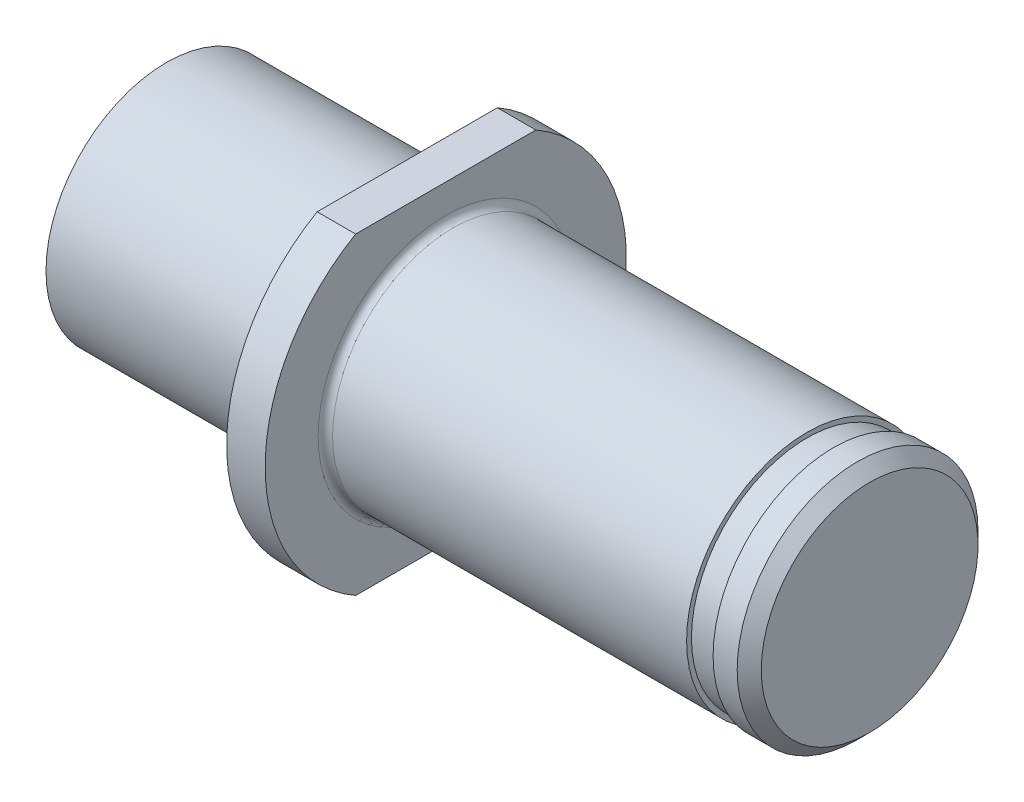
ISO-10303-21;
HEADER;
FILE_DESCRIPTION(('STEP AP214'),'2;1');
FILE_NAME('part.step','',(''),(''),'','','');
FILE_SCHEMA(('AUTOMOTIVE_DESIGN { 1 0 10303 214 1 1 1 1 }'));
ENDSEC;
DATA;
#1=APPLICATION_CONTEXT('core data for automotive mechanical design processes');
#2=APPLICATION_PROTOCOL_DEFINITION('international standard','automotive_design',2000,#1);
#3=PRODUCT_CONTEXT('',#1,'mechanical');
#4=PRODUCT('Part','Part','',(#3));
#5=PRODUCT_RELATED_PRODUCT_CATEGORY('part','',(#4));
#6=PRODUCT_DEFINITION_FORMATION('','',#4);
#7=PRODUCT_DEFINITION_CONTEXT('part definition',#1,'design');
#8=PRODUCT_DEFINITION('design','',#6,#7);
#9=PRODUCT_DEFINITION_SHAPE('','',#8);
#10=(LENGTH_UNIT() NAMED_UNIT(*) SI_UNIT(.MILLI.,.METRE.));
#11=(NAMED_UNIT(*) PLANE_ANGLE_UNIT() SI_UNIT($,.RADIAN.));
#12=(NAMED_UNIT(*) SI_UNIT($,.STERADIAN.) SOLID_ANGLE_UNIT());
#13=UNCERTAINTY_MEASURE_WITH_UNIT(LENGTH_MEASURE(1.E-05),#10,'distance_accuracy_value','');
#14=(GEOMETRIC_REPRESENTATION_CONTEXT(3) GLOBAL_UNCERTAINTY_ASSIGNED_CONTEXT((#13)) GLOBAL_UNIT_ASSIGNED_CONTEXT((#10,
#11,#12)) REPRESENTATION_CONTEXT('',''));
#15=CARTESIAN_POINT('',(0.,0.,0.));
#16=DIRECTION('',(0.,0.,1.));
#17=DIRECTION('',(1.,0.,0.));
#18=AXIS2_PLACEMENT_3D('',#15,#16,#17);
#19=CARTESIAN_POINT('',(-55.6714508421755,0.,0.));
#20=DIRECTION('',(-1.,0.,0.));
#21=DIRECTION('',(0.,0.,1.));
#22=AXIS2_PLACEMENT_3D('',#19,#20,#21);
#23=CYLINDRICAL_SURFACE('',#22,7.5);
#24=CARTESIAN_POINT('',(-0.699999999999999,0.,0.));
#25=DIRECTION('',(-1.,0.,0.));
#26=DIRECTION('',(0.,0.,1.));
#27=AXIS2_PLACEMENT_3D('',#24,#25,#26);
#28=CIRCLE('',#27,7.5);
#29=CARTESIAN_POINT('',(-0.699999999999999,-6.5,3.74165738677394));
#30=VERTEX_POINT('',#29);
#31=CARTESIAN_POINT('',(-0.699999999999999,6.5,3.74165738677394));
#32=VERTEX_POINT('',#31);
#33=EDGE_CURVE('E87',#30,#32,#28,.T.);
#34=ORIENTED_EDGE('',*,*,#33,.T.);
#35=DIRECTION('',(1.,0.,0.));
#36=VECTOR('',#35,1.);
#37=CARTESIAN_POINT('',(-7.5,6.5,3.74165738677394));
#38=LINE('',#37,#36);
#39=CARTESIAN_POINT('',(-2.3,6.5,3.74165738677394));
#40=VERTEX_POINT('',#39);
#41=EDGE_CURVE('E77',#40,#32,#38,.T.);
#42=ORIENTED_EDGE('',*,*,#41,.F.);
#43=CARTESIAN_POINT('',(-2.3,0.,0.));
#44=DIRECTION('',(-1.,0.,0.));
#45=DIRECTION('',(0.,0.,1.));
#46=AXIS2_PLACEMENT_3D('',#43,#44,#45);
#47=CIRCLE('',#46,7.5);
#48=CARTESIAN_POINT('',(-2.3,-6.5,3.74165738677394));
#49=VERTEX_POINT('',#48);
#50=EDGE_CURVE('E85',#49,#40,#47,.T.);
#51=ORIENTED_EDGE('',*,*,#50,.F.);
#52=DIRECTION('',(1.,0.,0.));
#53=VECTOR('',#52,1.);
#54=CARTESIAN_POINT('',(-7.5,-6.5,3.74165738677394));
#55=LINE('',#54,#53);
#56=EDGE_CURVE('E59',#49,#30,#55,.T.);
#57=ORIENTED_EDGE('',*,*,#56,.T.);
#58=EDGE_LOOP('',(#34,#42,#51,#57));
#59=FACE_BOUND('',#58,.T.);
#60=ADVANCED_FACE('F37',(#59),#23,.T.);
#61=CARTESIAN_POINT('',(16.9,4.5,0.));
#62=DIRECTION('',(-1.,0.,0.));
#63=DIRECTION('',(0.,0.,1.));
#64=AXIS2_PLACEMENT_3D('',#61,#62,#63);
#65=PLANE('',#64);
#66=CARTESIAN_POINT('',(16.9,0.,0.));
#67=DIRECTION('',(-1.,0.,0.));
#68=DIRECTION('',(0.,0.,1.));
#69=AXIS2_PLACEMENT_3D('',#66,#67,#68);
#70=CIRCLE('',#69,4.5);
#71=CARTESIAN_POINT('',(16.9,0.,4.5));
#72=VERTEX_POINT('',#71);
#73=EDGE_CURVE('E119',#72,#72,#70,.T.);
#74=ORIENTED_EDGE('',*,*,#73,.F.);
#75=EDGE_LOOP('',(#74));
#76=FACE_BOUND('',#75,.T.);
#77=ADVANCED_FACE('F39',(#76),#65,.F.);
#78=CARTESIAN_POINT('',(16.9,0.,0.));
#79=DIRECTION('',(-1.,0.,0.));
#80=DIRECTION('',(0.,0.,1.));
#81=AXIS2_PLACEMENT_3D('',#78,#79,#80);
#82=CONICAL_SURFACE('',#81,4.5,0.785398163397447);
#83=CARTESIAN_POINT('',(16.4,0.,0.));
#84=DIRECTION('',(-1.,0.,0.));
#85=DIRECTION('',(0.,0.,1.));
#86=AXIS2_PLACEMENT_3D('',#83,#84,#85);
#87=CIRCLE('',#86,5.);
#88=CARTESIAN_POINT('',(16.4,0.,5.));
#89=VERTEX_POINT('',#88);
#90=EDGE_CURVE('E116',#89,#89,#87,.T.);
#91=ORIENTED_EDGE('',*,*,#90,.F.);
#92=EDGE_LOOP('',(#91));
#93=FACE_BOUND('',#92,.T.);
#94=ORIENTED_EDGE('',*,*,#73,.T.);
#95=EDGE_LOOP('',(#94));
#96=FACE_BOUND('',#95,.T.);
#97=ADVANCED_FACE('F123',(#93,#96),#82,.T.);
#98=CARTESIAN_POINT('',(-55.6714508421755,0.,0.));
#99=DIRECTION('',(-1.,0.,0.));
#100=DIRECTION('',(0.,0.,1.));
#101=AXIS2_PLACEMENT_3D('',#98,#99,#100);
#102=CYLINDRICAL_SURFACE('',#101,5.);
#103=CARTESIAN_POINT('',(15.4,0.,0.));
#104=DIRECTION('',(-1.,0.,0.));
#105=DIRECTION('',(0.,0.,1.));
#106=AXIS2_PLACEMENT_3D('',#103,#104,#105);
#107=CIRCLE('',#106,5.);
#108=CARTESIAN_POINT('',(15.4,0.,5.));
#109=VERTEX_POINT('',#108);
#110=EDGE_CURVE('E113',#109,#109,#107,.T.);
#111=ORIENTED_EDGE('',*,*,#110,.F.);
#112=EDGE_LOOP('',(#111));
#113=FACE_BOUND('',#112,.T.);
#114=ORIENTED_EDGE('',*,*,#90,.T.);
#115=EDGE_LOOP('',(#114));
#116=FACE_BOUND('',#115,.T.);
#117=ADVANCED_FACE('F130',(#113,#116),#102,.T.);
#118=CARTESIAN_POINT('',(15.4,4.8,0.));
#119=DIRECTION('',(1.,0.,0.));
#120=DIRECTION('',(0.,0.,-1.));
#121=AXIS2_PLACEMENT_3D('',#118,#119,#120);
#122=PLANE('',#121);
#123=CARTESIAN_POINT('',(15.4,0.,0.));
#124=DIRECTION('',(-1.,0.,0.));
#125=DIRECTION('',(0.,0.,1.));
#126=AXIS2_PLACEMENT_3D('',#123,#124,#125);
#127=CIRCLE('',#126,4.8);
#128=CARTESIAN_POINT('',(15.4,0.,4.8));
#129=VERTEX_POINT('',#128);
#130=EDGE_CURVE('E110',#129,#129,#127,.T.);
#131=ORIENTED_EDGE('',*,*,#130,.F.);
#132=EDGE_LOOP('',(#131));
#133=FACE_BOUND('',#132,.T.);
#134=ORIENTED_EDGE('',*,*,#110,.T.);
#135=EDGE_LOOP('',(#134));
#136=FACE_BOUND('',#135,.T.);
#137=ADVANCED_FACE('F280',(#133,#136),#122,.F.);
#138=CARTESIAN_POINT('',(-55.6714508421755,0.,0.));
#139=DIRECTION('',(-1.,0.,0.));
#140=DIRECTION('',(0.,0.,1.));
#141=AXIS2_PLACEMENT_3D('',#138,#139,#140);
#142=CYLINDRICAL_SURFACE('',#141,4.8);
#143=CARTESIAN_POINT('',(14.3,0.,0.));
#144=DIRECTION('',(-1.,0.,0.));
#145=DIRECTION('',(0.,0.,1.));
#146=AXIS2_PLACEMENT_3D('',#143,#144,#145);
#147=CIRCLE('',#146,4.8);
#148=CARTESIAN_POINT('',(14.3,0.,4.8));
#149=VERTEX_POINT('',#148);
#150=EDGE_CURVE('E107',#149,#149,#147,.T.);
#151=ORIENTED_EDGE('',*,*,#150,.F.);
#152=EDGE_LOOP('',(#151));
#153=FACE_BOUND('',#152,.T.);
#154=ORIENTED_EDGE('',*,*,#130,.T.);
#155=EDGE_LOOP('',(#154));
#156=FACE_BOUND('',#155,.T.);
#157=ADVANCED_FACE('F272',(#153,#156),#142,.T.);
#158=CARTESIAN_POINT('',(14.3,5.,0.));
#159=DIRECTION('',(-1.,0.,0.));
#160=DIRECTION('',(0.,0.,1.));
#161=AXIS2_PLACEMENT_3D('',#158,#159,#160);
#162=PLANE('',#161);
#163=CARTESIAN_POINT('',(14.3,0.,0.));
#164=DIRECTION('',(-1.,0.,0.));
#165=DIRECTION('',(0.,0.,1.));
#166=AXIS2_PLACEMENT_3D('',#163,#164,#165);
#167=CIRCLE('',#166,5.);
#168=CARTESIAN_POINT('',(14.3,0.,5.));
#169=VERTEX_POINT('',#168);
#170=EDGE_CURVE('E104',#169,#169,#167,.T.);
#171=ORIENTED_EDGE('',*,*,#170,.F.);
#172=EDGE_LOOP('',(#171));
#173=FACE_BOUND('',#172,.T.);
#174=ORIENTED_EDGE('',*,*,#150,.T.);
#175=EDGE_LOOP('',(#174));
#176=FACE_BOUND('',#175,.T.);
#177=ADVANCED_FACE('F264',(#173,#176),#162,.F.);
#178=CARTESIAN_POINT('',(-55.6714508421755,0.,0.));
#179=DIRECTION('',(-1.,0.,0.));
#180=DIRECTION('',(0.,0.,1.));
#181=AXIS2_PLACEMENT_3D('',#178,#179,#180);
#182=CYLINDRICAL_SURFACE('',#181,5.);
#183=CARTESIAN_POINT('',(-0.399999999999998,0.,0.));
#184=DIRECTION('',(-1.,0.,0.));
#185=DIRECTION('',(0.,0.,1.));
#186=AXIS2_PLACEMENT_3D('',#183,#184,#185);
#187=CIRCLE('',#186,5.);
#188=CARTESIAN_POINT('',(-0.399999999999998,0.,5.));
#189=VERTEX_POINT('',#188);
#190=EDGE_CURVE('E101',#189,#189,#187,.T.);
#191=ORIENTED_EDGE('',*,*,#190,.F.);
#192=EDGE_LOOP('',(#191));
#193=FACE_BOUND('',#192,.T.);
#194=ORIENTED_EDGE('',*,*,#170,.T.);
#195=EDGE_LOOP('',(#194));
#196=FACE_BOUND('',#195,.T.);
#197=ADVANCED_FACE('F257',(#193,#196),#182,.T.);
#198=CARTESIAN_POINT('',(-0.4,0.,0.));
#199=DIRECTION('',(-1.,0.,0.));
#200=DIRECTION('',(0.,0.,1.));
#201=AXIS2_PLACEMENT_3D('',#198,#199,#200);
#202=TOROIDAL_SURFACE('',#201,5.3,0.3);
#203=CARTESIAN_POINT('',(-0.699999999999999,0.,0.));
#204=DIRECTION('',(-1.,0.,0.));
#205=DIRECTION('',(0.,0.,1.));
#206=AXIS2_PLACEMENT_3D('',#203,#204,#205);
#207=CIRCLE('',#206,5.3);
#208=CARTESIAN_POINT('',(-0.699999999999999,0.,5.3));
#209=VERTEX_POINT('',#208);
#210=EDGE_CURVE('E98',#209,#209,#207,.T.);
#211=ORIENTED_EDGE('',*,*,#210,.F.);
#212=EDGE_LOOP('',(#211));
#213=FACE_BOUND('',#212,.T.);
#214=ORIENTED_EDGE('',*,*,#190,.T.);
#215=EDGE_LOOP('',(#214));
#216=FACE_BOUND('',#215,.T.);
#217=ADVANCED_FACE('F147',(#213,#216),#202,.F.);
#218=CARTESIAN_POINT('',(-0.7,7.5,0.));
#219=DIRECTION('',(-1.,0.,0.));
#220=DIRECTION('',(0.,0.,1.));
#221=AXIS2_PLACEMENT_3D('',#218,#219,#220);
#222=PLANE('',#221);
#223=CARTESIAN_POINT('',(-0.699999999999999,6.5,-3.74165738677394));
#224=VERTEX_POINT('',#223);
#225=CARTESIAN_POINT('',(-0.699999999999999,-6.5,-3.74165738677394));
#226=VERTEX_POINT('',#225);
#227=EDGE_CURVE('E90',#224,#226,#28,.T.);
#228=ORIENTED_EDGE('',*,*,#227,.F.);
#229=DIRECTION('',(0.,0.,1.));
#230=VECTOR('',#229,1.);
#231=CARTESIAN_POINT('',(-0.7,6.5,0.));
#232=LINE('',#231,#230);
#233=EDGE_CURVE('E156',#224,#32,#232,.T.);
#234=ORIENTED_EDGE('',*,*,#233,.T.);
#235=ORIENTED_EDGE('',*,*,#33,.F.);
#236=DIRECTION('',(0.,0.,-1.));
#237=VECTOR('',#236,1.);
#238=CARTESIAN_POINT('',(-0.7,-6.5,0.));
#239=LINE('',#238,#237);
#240=EDGE_CURVE('E155',#30,#226,#239,.T.);
#241=ORIENTED_EDGE('',*,*,#240,.T.);
#242=EDGE_LOOP('',(#228,#234,#235,#241));
#243=FACE_BOUND('',#242,.T.);
#244=ORIENTED_EDGE('',*,*,#210,.T.);
#245=EDGE_LOOP('',(#244));
#246=FACE_BOUND('',#245,.T.);
#247=ADVANCED_FACE('F139',(#243,#246),#222,.F.);
#248=CARTESIAN_POINT('',(-2.3,6.5,-3.74165738677394));
#249=VERTEX_POINT('',#248);
#250=CARTESIAN_POINT('',(-2.3,-6.5,-3.74165738677394));
#251=VERTEX_POINT('',#250);
#252=EDGE_CURVE('E91',#249,#251,#47,.T.);
#253=ORIENTED_EDGE('',*,*,#252,.F.);
#254=DIRECTION('',(1.,0.,0.));
#255=VECTOR('',#254,1.);
#256=CARTESIAN_POINT('',(-7.5,6.5,-3.74165738677394));
#257=LINE('',#256,#255);
#258=EDGE_CURVE('E52',#249,#224,#257,.T.);
#259=ORIENTED_EDGE('',*,*,#258,.T.);
#260=ORIENTED_EDGE('',*,*,#227,.T.);
#261=DIRECTION('',(1.,0.,0.));
#262=VECTOR('',#261,1.);
#263=CARTESIAN_POINT('',(-7.5,-6.5,-3.74165738677394));
#264=LINE('',#263,#262);
#265=EDGE_CURVE('E152',#251,#226,#264,.T.);
#266=ORIENTED_EDGE('',*,*,#265,.F.);
#267=EDGE_LOOP('',(#253,#259,#260,#266));
#268=FACE_BOUND('',#267,.T.);
#269=ADVANCED_FACE('F133',(#268),#23,.T.);
#270=CARTESIAN_POINT('',(-2.3,4.25,0.));
#271=DIRECTION('',(1.,0.,0.));
#272=DIRECTION('',(0.,0.,-1.));
#273=AXIS2_PLACEMENT_3D('',#270,#271,#272);
#274=PLANE('',#273);
#275=CARTESIAN_POINT('',(-2.3,0.,0.));
#276=DIRECTION('',(-1.,0.,0.));
#277=DIRECTION('',(0.,0.,1.));
#278=AXIS2_PLACEMENT_3D('',#275,#276,#277);
#279=CIRCLE('',#278,4.25);
#280=CARTESIAN_POINT('',(-2.3,0.,4.25));
#281=VERTEX_POINT('',#280);
#282=EDGE_CURVE('E94',#281,#281,#279,.T.);
#283=ORIENTED_EDGE('',*,*,#282,.F.);
#284=EDGE_LOOP('',(#283));
#285=FACE_BOUND('',#284,.T.);
#286=ORIENTED_EDGE('',*,*,#50,.T.);
#287=DIRECTION('',(0.,0.,-1.));
#288=VECTOR('',#287,1.);
#289=CARTESIAN_POINT('',(-2.3,6.5,0.));
#290=LINE('',#289,#288);
#291=EDGE_CURVE('E11',#40,#249,#290,.T.);
#292=ORIENTED_EDGE('',*,*,#291,.T.);
#293=ORIENTED_EDGE('',*,*,#252,.T.);
#294=DIRECTION('',(0.,0.,1.));
#295=VECTOR('',#294,1.);
#296=CARTESIAN_POINT('',(-2.3,-6.5,0.));
#297=LINE('',#296,#295);
#298=EDGE_CURVE('E45',#251,#49,#297,.T.);
#299=ORIENTED_EDGE('',*,*,#298,.T.);
#300=EDGE_LOOP('',(#286,#292,#293,#299));
#301=FACE_BOUND('',#300,.T.);
#302=ADVANCED_FACE('F89',(#285,#301),#274,.F.);
#303=CARTESIAN_POINT('',(-55.6714508421755,0.,0.));
#304=DIRECTION('',(-1.,0.,0.));
#305=DIRECTION('',(0.,0.,1.));
#306=AXIS2_PLACEMENT_3D('',#303,#304,#305);
#307=CYLINDRICAL_SURFACE('',#306,4.25);
#308=CARTESIAN_POINT('',(-3.05,0.,0.));
#309=DIRECTION('',(-1.,0.,0.));
#310=DIRECTION('',(0.,0.,1.));
#311=AXIS2_PLACEMENT_3D('',#308,#309,#310);
#312=CIRCLE('',#311,4.25);
#313=CARTESIAN_POINT('',(-3.05,0.,4.25));
#314=VERTEX_POINT('',#313);
#315=EDGE_CURVE('E167',#314,#314,#312,.T.);
#316=ORIENTED_EDGE('',*,*,#315,.F.);
#317=EDGE_LOOP('',(#316));
#318=FACE_BOUND('',#317,.T.);
#319=ORIENTED_EDGE('',*,*,#282,.T.);
#320=EDGE_LOOP('',(#319));
#321=FACE_BOUND('',#320,.T.);
#322=ADVANCED_FACE('F145',(#318,#321),#307,.T.);
#323=CARTESIAN_POINT('',(-3.05,5.,0.));
#324=DIRECTION('',(-1.,0.,0.));
#325=DIRECTION('',(0.,0.,1.));
#326=AXIS2_PLACEMENT_3D('',#323,#324,#325);
#327=PLANE('',#326);
#328=CARTESIAN_POINT('',(-3.05,0.,0.));
#329=DIRECTION('',(-1.,0.,0.));
#330=DIRECTION('',(0.,0.,1.));
#331=AXIS2_PLACEMENT_3D('',#328,#329,#330);
#332=CIRCLE('',#331,5.);
#333=CARTESIAN_POINT('',(-3.05,0.,5.));
#334=VERTEX_POINT('',#333);
#335=EDGE_CURVE('E162',#334,#334,#332,.T.);
#336=ORIENTED_EDGE('',*,*,#335,.F.);
#337=EDGE_LOOP('',(#336));
#338=FACE_BOUND('',#337,.T.);
#339=ORIENTED_EDGE('',*,*,#315,.T.);
#340=EDGE_LOOP('',(#339));
#341=FACE_BOUND('',#340,.T.);
#342=ADVANCED_FACE('F175',(#338,#341),#327,.F.);
#343=CARTESIAN_POINT('',(-55.6714508421755,0.,0.));
#344=DIRECTION('',(-1.,0.,0.));
#345=DIRECTION('',(0.,0.,1.));
#346=AXIS2_PLACEMENT_3D('',#343,#344,#345);
#347=CYLINDRICAL_SURFACE('',#346,5.);
#348=CARTESIAN_POINT('',(-12.3,0.,0.));
#349=DIRECTION('',(-1.,0.,0.));
#350=DIRECTION('',(0.,0.,1.));
#351=AXIS2_PLACEMENT_3D('',#348,#349,#350);
#352=CIRCLE('',#351,5.);
#353=CARTESIAN_POINT('',(-12.3,0.,5.));
#354=VERTEX_POINT('',#353);
#355=EDGE_CURVE('E159',#354,#354,#352,.T.);
#356=ORIENTED_EDGE('',*,*,#355,.F.);
#357=EDGE_LOOP('',(#356));
#358=FACE_BOUND('',#357,.T.);
#359=ORIENTED_EDGE('',*,*,#335,.T.);
#360=EDGE_LOOP('',(#359));
#361=FACE_BOUND('',#360,.T.);
#362=ADVANCED_FACE('F181',(#358,#361),#347,.T.);
#363=CARTESIAN_POINT('',(-12.3,0.,0.));
#364=DIRECTION('',(1.,0.,0.));
#365=DIRECTION('',(0.,0.,-1.));
#366=AXIS2_PLACEMENT_3D('',#363,#364,#365);
#367=PLANE('',#366);
#368=ORIENTED_EDGE('',*,*,#355,.T.);
#369=EDGE_LOOP('',(#368));
#370=FACE_BOUND('',#369,.T.);
#371=ADVANCED_FACE('F187',(#370),#367,.F.);
#372=CARTESIAN_POINT('',(-7.5,-6.5,3.74165738677394));
#373=DIRECTION('',(0.,1.,0.));
#374=DIRECTION('',(0.,0.,1.));
#375=AXIS2_PLACEMENT_3D('',#372,#373,#374);
#376=PLANE('',#375);
#377=ORIENTED_EDGE('',*,*,#56,.F.);
#378=ORIENTED_EDGE('',*,*,#298,.F.);
#379=ORIENTED_EDGE('',*,*,#265,.T.);
#380=ORIENTED_EDGE('',*,*,#240,.F.);
#381=EDGE_LOOP('',(#377,#378,#379,#380));
#382=FACE_BOUND('',#381,.T.);
#383=ADVANCED_FACE('F153',(#382),#376,.F.);
#384=CARTESIAN_POINT('',(-7.5,6.5,3.74165738677394));
#385=DIRECTION('',(0.,-1.,0.));
#386=DIRECTION('',(0.,0.,-1.));
#387=AXIS2_PLACEMENT_3D('',#384,#385,#386);
#388=PLANE('',#387);
#389=ORIENTED_EDGE('',*,*,#258,.F.);
#390=ORIENTED_EDGE('',*,*,#291,.F.);
#391=ORIENTED_EDGE('',*,*,#41,.T.);
#392=ORIENTED_EDGE('',*,*,#233,.F.);
#393=EDGE_LOOP('',(#389,#390,#391,#392));
#394=FACE_BOUND('',#393,.T.);
#395=ADVANCED_FACE('F76',(#394),#388,.F.);
#396=CLOSED_SHELL('',(#60,#77,#97,#117,#137,#157,#177,#197,#217,#247,#269,#302,#322,#342,#362,
#371,#383,#395));
#397=MANIFOLD_SOLID_BREP('B2',#396);
#398=ADVANCED_BREP_SHAPE_REPRESENTATION('',(#18,#397),#14);
#399=SHAPE_DEFINITION_REPRESENTATION(#9,#398);
ENDSEC;
END-ISO-10303-21;
